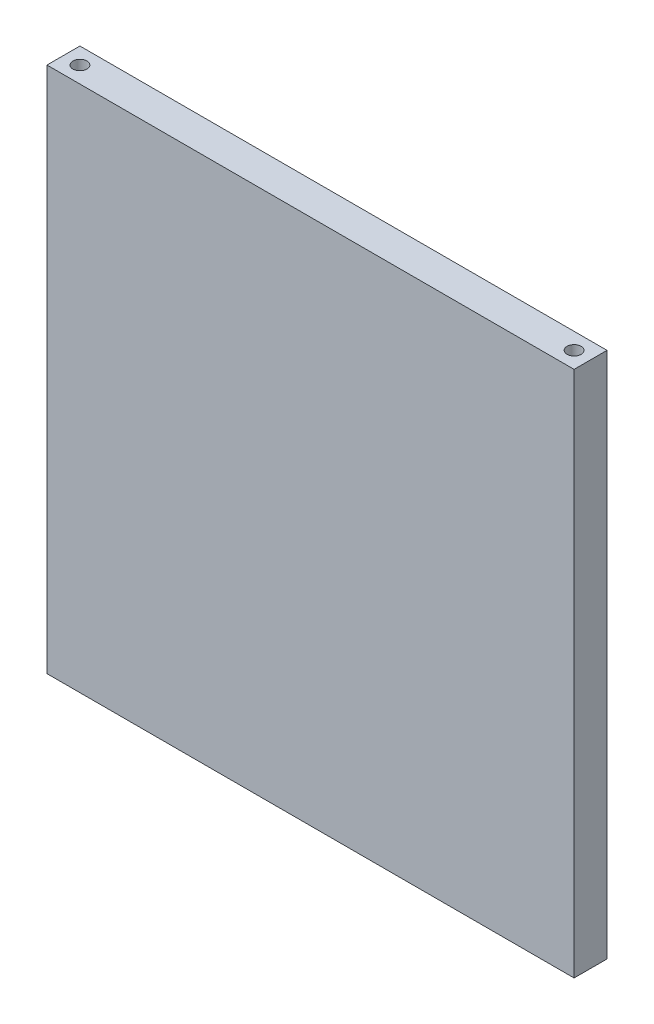
ISO-10303-21;
HEADER;
FILE_DESCRIPTION(('STEP AP214'),'2;1');
FILE_NAME('part.step','',(''),(''),'','','');
FILE_SCHEMA(('AUTOMOTIVE_DESIGN { 1 0 10303 214 1 1 1 1 }'));
ENDSEC;
DATA;
#1=APPLICATION_CONTEXT('core data for automotive mechanical design processes');
#2=APPLICATION_PROTOCOL_DEFINITION('international standard','automotive_design',2000,#1);
#3=PRODUCT_CONTEXT('',#1,'mechanical');
#4=PRODUCT('Part','Part','',(#3));
#5=PRODUCT_RELATED_PRODUCT_CATEGORY('part','',(#4));
#6=PRODUCT_DEFINITION_FORMATION('','',#4);
#7=PRODUCT_DEFINITION_CONTEXT('part definition',#1,'design');
#8=PRODUCT_DEFINITION('design','',#6,#7);
#9=PRODUCT_DEFINITION_SHAPE('','',#8);
#10=(LENGTH_UNIT() NAMED_UNIT(*) SI_UNIT(.MILLI.,.METRE.));
#11=(NAMED_UNIT(*) PLANE_ANGLE_UNIT() SI_UNIT($,.RADIAN.));
#12=(NAMED_UNIT(*) SI_UNIT($,.STERADIAN.) SOLID_ANGLE_UNIT());
#13=UNCERTAINTY_MEASURE_WITH_UNIT(LENGTH_MEASURE(1.E-05),#10,'distance_accuracy_value','');
#14=(GEOMETRIC_REPRESENTATION_CONTEXT(3) GLOBAL_UNCERTAINTY_ASSIGNED_CONTEXT((#13)) GLOBAL_UNIT_ASSIGNED_CONTEXT((#10,
#11,#12)) REPRESENTATION_CONTEXT('',''));
#15=CARTESIAN_POINT('',(0.,0.,0.));
#16=DIRECTION('',(0.,0.,1.));
#17=DIRECTION('',(1.,0.,0.));
#18=AXIS2_PLACEMENT_3D('',#15,#16,#17);
#19=CARTESIAN_POINT('',(0.,0.,6.35));
#20=DIRECTION('',(1.,0.,0.));
#21=DIRECTION('',(0.,1.,0.));
#22=AXIS2_PLACEMENT_3D('',#19,#20,#21);
#23=PLANE('',#22);
#24=DIRECTION('',(0.,-1.,0.));
#25=VECTOR('',#24,1.);
#26=CARTESIAN_POINT('',(0.,0.,0.));
#27=LINE('',#26,#25);
#28=CARTESIAN_POINT('',(0.,101.6,0.));
#29=VERTEX_POINT('',#28);
#30=CARTESIAN_POINT('',(0.,0.,0.));
#31=VERTEX_POINT('',#30);
#32=EDGE_CURVE('E130',#29,#31,#27,.T.);
#33=ORIENTED_EDGE('',*,*,#32,.T.);
#34=DIRECTION('',(0.,0.,-1.));
#35=VECTOR('',#34,1.);
#36=CARTESIAN_POINT('',(0.,0.,6.35));
#37=LINE('',#36,#35);
#38=CARTESIAN_POINT('',(0.,0.,6.35));
#39=VERTEX_POINT('',#38);
#40=EDGE_CURVE('E11',#39,#31,#37,.T.);
#41=ORIENTED_EDGE('',*,*,#40,.F.);
#42=DIRECTION('',(0.,-1.,0.));
#43=VECTOR('',#42,1.);
#44=CARTESIAN_POINT('',(0.,0.,6.35));
#45=LINE('',#44,#43);
#46=CARTESIAN_POINT('',(0.,101.6,6.35));
#47=VERTEX_POINT('',#46);
#48=EDGE_CURVE('E131',#47,#39,#45,.T.);
#49=ORIENTED_EDGE('',*,*,#48,.F.);
#50=DIRECTION('',(0.,0.,-1.));
#51=VECTOR('',#50,1.);
#52=CARTESIAN_POINT('',(0.,101.6,6.35));
#53=LINE('',#52,#51);
#54=EDGE_CURVE('E137',#47,#29,#53,.T.);
#55=ORIENTED_EDGE('',*,*,#54,.T.);
#56=EDGE_LOOP('',(#33,#41,#49,#55));
#57=FACE_BOUND('',#56,.T.);
#58=ADVANCED_FACE('F37',(#57),#23,.F.);
#59=CARTESIAN_POINT('',(0.,0.,6.35));
#60=DIRECTION('',(0.,1.,0.));
#61=DIRECTION('',(0.,0.,1.));
#62=AXIS2_PLACEMENT_3D('',#59,#60,#61);
#63=PLANE('',#62);
#64=CARTESIAN_POINT('',(3.17500000000002,0.,3.175));
#65=DIRECTION('',(0.,-1.,0.));
#66=DIRECTION('',(0.,0.,-1.));
#67=AXIS2_PLACEMENT_3D('',#64,#65,#66);
#68=CIRCLE('',#67,1.35254999999999);
#69=CARTESIAN_POINT('',(3.17500000000002,0.,1.82245000000001));
#70=VERTEX_POINT('',#69);
#71=EDGE_CURVE('E108',#70,#70,#68,.T.);
#72=ORIENTED_EDGE('',*,*,#71,.F.);
#73=EDGE_LOOP('',(#72));
#74=FACE_BOUND('',#73,.T.);
#75=CARTESIAN_POINT('',(98.425,0.,3.175));
#76=DIRECTION('',(0.,-1.,0.));
#77=DIRECTION('',(0.,0.,-1.));
#78=AXIS2_PLACEMENT_3D('',#75,#76,#77);
#79=CIRCLE('',#78,1.35254999999999);
#80=CARTESIAN_POINT('',(98.425,0.,1.82245000000001));
#81=VERTEX_POINT('',#80);
#82=EDGE_CURVE('E107',#81,#81,#79,.T.);
#83=ORIENTED_EDGE('',*,*,#82,.F.);
#84=EDGE_LOOP('',(#83));
#85=FACE_BOUND('',#84,.T.);
#86=DIRECTION('',(1.,0.,0.));
#87=VECTOR('',#86,1.);
#88=CARTESIAN_POINT('',(0.,0.,0.));
#89=LINE('',#88,#87);
#90=CARTESIAN_POINT('',(101.6,0.,0.));
#91=VERTEX_POINT('',#90);
#92=EDGE_CURVE('E140',#31,#91,#89,.T.);
#93=ORIENTED_EDGE('',*,*,#92,.T.);
#94=DIRECTION('',(0.,0.,-1.));
#95=VECTOR('',#94,1.);
#96=CARTESIAN_POINT('',(101.6,0.,6.35));
#97=LINE('',#96,#95);
#98=CARTESIAN_POINT('',(101.6,0.,6.35));
#99=VERTEX_POINT('',#98);
#100=EDGE_CURVE('E45',#99,#91,#97,.T.);
#101=ORIENTED_EDGE('',*,*,#100,.F.);
#102=DIRECTION('',(1.,0.,0.));
#103=VECTOR('',#102,1.);
#104=CARTESIAN_POINT('',(0.,0.,6.35));
#105=LINE('',#104,#103);
#106=EDGE_CURVE('E84',#39,#99,#105,.T.);
#107=ORIENTED_EDGE('',*,*,#106,.F.);
#108=ORIENTED_EDGE('',*,*,#40,.T.);
#109=EDGE_LOOP('',(#93,#101,#107,#108));
#110=FACE_BOUND('',#109,.T.);
#111=ADVANCED_FACE('F164',(#74,#85,#110),#63,.F.);
#112=CARTESIAN_POINT('',(101.6,0.,6.35));
#113=DIRECTION('',(-1.,0.,0.));
#114=DIRECTION('',(0.,-1.,0.));
#115=AXIS2_PLACEMENT_3D('',#112,#113,#114);
#116=PLANE('',#115);
#117=DIRECTION('',(0.,1.,0.));
#118=VECTOR('',#117,1.);
#119=CARTESIAN_POINT('',(101.6,0.,0.));
#120=LINE('',#119,#118);
#121=CARTESIAN_POINT('',(101.6,101.6,0.));
#122=VERTEX_POINT('',#121);
#123=EDGE_CURVE('E71',#91,#122,#120,.T.);
#124=ORIENTED_EDGE('',*,*,#123,.T.);
#125=DIRECTION('',(0.,0.,-1.));
#126=VECTOR('',#125,1.);
#127=CARTESIAN_POINT('',(101.6,101.6,6.35));
#128=LINE('',#127,#126);
#129=CARTESIAN_POINT('',(101.6,101.6,6.35));
#130=VERTEX_POINT('',#129);
#131=EDGE_CURVE('E145',#130,#122,#128,.T.);
#132=ORIENTED_EDGE('',*,*,#131,.F.);
#133=DIRECTION('',(0.,1.,0.));
#134=VECTOR('',#133,1.);
#135=CARTESIAN_POINT('',(101.6,0.,6.35));
#136=LINE('',#135,#134);
#137=EDGE_CURVE('E134',#99,#130,#136,.T.);
#138=ORIENTED_EDGE('',*,*,#137,.F.);
#139=ORIENTED_EDGE('',*,*,#100,.T.);
#140=EDGE_LOOP('',(#124,#132,#138,#139));
#141=FACE_BOUND('',#140,.T.);
#142=ADVANCED_FACE('F147',(#141),#116,.F.);
#143=CARTESIAN_POINT('',(0.,101.6,6.35));
#144=DIRECTION('',(0.,-1.,0.));
#145=DIRECTION('',(0.,0.,-1.));
#146=AXIS2_PLACEMENT_3D('',#143,#144,#145);
#147=PLANE('',#146);
#148=CARTESIAN_POINT('',(3.175,101.6,3.175));
#149=DIRECTION('',(0.,1.,0.));
#150=DIRECTION('',(0.,0.,1.));
#151=AXIS2_PLACEMENT_3D('',#148,#149,#150);
#152=CIRCLE('',#151,1.35254999999999);
#153=CARTESIAN_POINT('',(3.175,101.6,4.52754999999999));
#154=VERTEX_POINT('',#153);
#155=EDGE_CURVE('E118',#154,#154,#152,.T.);
#156=ORIENTED_EDGE('',*,*,#155,.F.);
#157=EDGE_LOOP('',(#156));
#158=FACE_BOUND('',#157,.T.);
#159=CARTESIAN_POINT('',(98.425,101.6,3.175));
#160=DIRECTION('',(0.,1.,0.));
#161=DIRECTION('',(0.,0.,1.));
#162=AXIS2_PLACEMENT_3D('',#159,#160,#161);
#163=CIRCLE('',#162,1.35254999999999);
#164=CARTESIAN_POINT('',(98.425,101.6,4.52754999999999));
#165=VERTEX_POINT('',#164);
#166=EDGE_CURVE('E124',#165,#165,#163,.T.);
#167=ORIENTED_EDGE('',*,*,#166,.F.);
#168=EDGE_LOOP('',(#167));
#169=FACE_BOUND('',#168,.T.);
#170=DIRECTION('',(-1.,0.,0.));
#171=VECTOR('',#170,1.);
#172=CARTESIAN_POINT('',(0.,101.6,0.));
#173=LINE('',#172,#171);
#174=EDGE_CURVE('E77',#122,#29,#173,.T.);
#175=ORIENTED_EDGE('',*,*,#174,.T.);
#176=ORIENTED_EDGE('',*,*,#54,.F.);
#177=DIRECTION('',(-1.,0.,0.));
#178=VECTOR('',#177,1.);
#179=CARTESIAN_POINT('',(0.,101.6,6.35));
#180=LINE('',#179,#178);
#181=EDGE_CURVE('E53',#130,#47,#180,.T.);
#182=ORIENTED_EDGE('',*,*,#181,.F.);
#183=ORIENTED_EDGE('',*,*,#131,.T.);
#184=EDGE_LOOP('',(#175,#176,#182,#183));
#185=FACE_BOUND('',#184,.T.);
#186=ADVANCED_FACE('F154',(#158,#169,#185),#147,.F.);
#187=CARTESIAN_POINT('',(0.,0.,6.35));
#188=DIRECTION('',(0.,0.,-1.));
#189=DIRECTION('',(-1.,0.,0.));
#190=AXIS2_PLACEMENT_3D('',#187,#188,#189);
#191=PLANE('',#190);
#192=ORIENTED_EDGE('',*,*,#48,.T.);
#193=ORIENTED_EDGE('',*,*,#106,.T.);
#194=ORIENTED_EDGE('',*,*,#137,.T.);
#195=ORIENTED_EDGE('',*,*,#181,.T.);
#196=EDGE_LOOP('',(#192,#193,#194,#195));
#197=FACE_BOUND('',#196,.T.);
#198=ADVANCED_FACE('F156',(#197),#191,.F.);
#199=CARTESIAN_POINT('',(0.,0.,0.));
#200=DIRECTION('',(0.,0.,-1.));
#201=DIRECTION('',(-1.,0.,0.));
#202=AXIS2_PLACEMENT_3D('',#199,#200,#201);
#203=PLANE('',#202);
#204=ORIENTED_EDGE('',*,*,#32,.F.);
#205=ORIENTED_EDGE('',*,*,#174,.F.);
#206=ORIENTED_EDGE('',*,*,#123,.F.);
#207=ORIENTED_EDGE('',*,*,#92,.F.);
#208=EDGE_LOOP('',(#204,#205,#206,#207));
#209=FACE_BOUND('',#208,.T.);
#210=ADVANCED_FACE('F150',(#209),#203,.T.);
#211=CARTESIAN_POINT('',(98.425,92.202,3.175));
#212=DIRECTION('',(0.,1.,0.));
#213=DIRECTION('',(0.,0.,1.));
#214=AXIS2_PLACEMENT_3D('',#211,#212,#213);
#215=CONICAL_SURFACE('',#214,1.35254999999999,1.02974425867665);
#216=CARTESIAN_POINT('',(98.425,91.3893059697343,3.175));
#217=VERTEX_POINT('',#216);
#218=VERTEX_LOOP('',#217);
#219=FACE_BOUND('',#218,.T.);
#220=CARTESIAN_POINT('',(98.425,92.202,3.175));
#221=DIRECTION('',(0.,1.,0.));
#222=DIRECTION('',(0.,0.,1.));
#223=AXIS2_PLACEMENT_3D('',#220,#221,#222);
#224=CIRCLE('',#223,1.35254999999999);
#225=CARTESIAN_POINT('',(98.425,92.202,4.52754999999999));
#226=VERTEX_POINT('',#225);
#227=EDGE_CURVE('E127',#226,#226,#224,.T.);
#228=ORIENTED_EDGE('',*,*,#227,.T.);
#229=EDGE_LOOP('',(#228));
#230=FACE_BOUND('',#229,.T.);
#231=ADVANCED_FACE('F203',(#219,#230),#215,.F.);
#232=CARTESIAN_POINT('',(98.425,101.6,3.175));
#233=DIRECTION('',(0.,1.,0.));
#234=DIRECTION('',(0.,0.,1.));
#235=AXIS2_PLACEMENT_3D('',#232,#233,#234);
#236=CYLINDRICAL_SURFACE('',#235,1.35254999999999);
#237=ORIENTED_EDGE('',*,*,#227,.F.);
#238=EDGE_LOOP('',(#237));
#239=FACE_BOUND('',#238,.T.);
#240=ORIENTED_EDGE('',*,*,#166,.T.);
#241=EDGE_LOOP('',(#240));
#242=FACE_BOUND('',#241,.T.);
#243=ADVANCED_FACE('F199',(#239,#242),#236,.F.);
#244=CARTESIAN_POINT('',(3.175,92.202,3.175));
#245=DIRECTION('',(0.,1.,0.));
#246=DIRECTION('',(0.,0.,1.));
#247=AXIS2_PLACEMENT_3D('',#244,#245,#246);
#248=CONICAL_SURFACE('',#247,1.35254999999999,1.02974425867665);
#249=CARTESIAN_POINT('',(3.175,91.3893059697343,3.175));
#250=VERTEX_POINT('',#249);
#251=VERTEX_LOOP('',#250);
#252=FACE_BOUND('',#251,.T.);
#253=CARTESIAN_POINT('',(3.175,92.202,3.175));
#254=DIRECTION('',(0.,1.,0.));
#255=DIRECTION('',(0.,0.,1.));
#256=AXIS2_PLACEMENT_3D('',#253,#254,#255);
#257=CIRCLE('',#256,1.35254999999999);
#258=CARTESIAN_POINT('',(3.175,92.202,4.52754999999999));
#259=VERTEX_POINT('',#258);
#260=EDGE_CURVE('E121',#259,#259,#257,.T.);
#261=ORIENTED_EDGE('',*,*,#260,.T.);
#262=EDGE_LOOP('',(#261));
#263=FACE_BOUND('',#262,.T.);
#264=ADVANCED_FACE('F195',(#252,#263),#248,.F.);
#265=CARTESIAN_POINT('',(3.175,101.6,3.175));
#266=DIRECTION('',(0.,1.,0.));
#267=DIRECTION('',(0.,0.,1.));
#268=AXIS2_PLACEMENT_3D('',#265,#266,#267);
#269=CYLINDRICAL_SURFACE('',#268,1.35254999999999);
#270=ORIENTED_EDGE('',*,*,#260,.F.);
#271=EDGE_LOOP('',(#270));
#272=FACE_BOUND('',#271,.T.);
#273=ORIENTED_EDGE('',*,*,#155,.T.);
#274=EDGE_LOOP('',(#273));
#275=FACE_BOUND('',#274,.T.);
#276=ADVANCED_FACE('F187',(#272,#275),#269,.F.);
#277=CARTESIAN_POINT('',(98.425,9.39800000000003,3.175));
#278=DIRECTION('',(0.,-1.,0.));
#279=DIRECTION('',(0.,0.,-1.));
#280=AXIS2_PLACEMENT_3D('',#277,#278,#279);
#281=CONICAL_SURFACE('',#280,1.35254999999999,1.02974425867665);
#282=CARTESIAN_POINT('',(98.425,10.2106940302658,3.175));
#283=VERTEX_POINT('',#282);
#284=VERTEX_LOOP('',#283);
#285=FACE_BOUND('',#284,.T.);
#286=CARTESIAN_POINT('',(98.425,9.39800000000003,3.175));
#287=DIRECTION('',(0.,-1.,0.));
#288=DIRECTION('',(0.,0.,-1.));
#289=AXIS2_PLACEMENT_3D('',#286,#287,#288);
#290=CIRCLE('',#289,1.35254999999999);
#291=CARTESIAN_POINT('',(98.425,9.39800000000003,1.82245000000001));
#292=VERTEX_POINT('',#291);
#293=EDGE_CURVE('E111',#292,#292,#290,.T.);
#294=ORIENTED_EDGE('',*,*,#293,.T.);
#295=EDGE_LOOP('',(#294));
#296=FACE_BOUND('',#295,.T.);
#297=ADVANCED_FACE('F181',(#285,#296),#281,.F.);
#298=CARTESIAN_POINT('',(98.425,0.,3.175));
#299=DIRECTION('',(0.,-1.,0.));
#300=DIRECTION('',(0.,0.,-1.));
#301=AXIS2_PLACEMENT_3D('',#298,#299,#300);
#302=CYLINDRICAL_SURFACE('',#301,1.35254999999999);
#303=ORIENTED_EDGE('',*,*,#293,.F.);
#304=EDGE_LOOP('',(#303));
#305=FACE_BOUND('',#304,.T.);
#306=ORIENTED_EDGE('',*,*,#82,.T.);
#307=EDGE_LOOP('',(#306));
#308=FACE_BOUND('',#307,.T.);
#309=ADVANCED_FACE('F101',(#305,#308),#302,.F.);
#310=CARTESIAN_POINT('',(3.17500000000002,9.39799999999999,3.175));
#311=DIRECTION('',(0.,-1.,0.));
#312=DIRECTION('',(0.,0.,-1.));
#313=AXIS2_PLACEMENT_3D('',#310,#311,#312);
#314=CONICAL_SURFACE('',#313,1.35254999999999,1.02974425867665);
#315=CARTESIAN_POINT('',(3.17500000000002,10.2106940302657,3.175));
#316=VERTEX_POINT('',#315);
#317=VERTEX_LOOP('',#316);
#318=FACE_BOUND('',#317,.T.);
#319=CARTESIAN_POINT('',(3.17500000000002,9.39799999999999,3.175));
#320=DIRECTION('',(0.,-1.,0.));
#321=DIRECTION('',(0.,0.,-1.));
#322=AXIS2_PLACEMENT_3D('',#319,#320,#321);
#323=CIRCLE('',#322,1.35254999999999);
#324=CARTESIAN_POINT('',(3.17500000000002,9.39799999999999,1.82245000000001));
#325=VERTEX_POINT('',#324);
#326=EDGE_CURVE('E105',#325,#325,#323,.T.);
#327=ORIENTED_EDGE('',*,*,#326,.T.);
#328=EDGE_LOOP('',(#327));
#329=FACE_BOUND('',#328,.T.);
#330=ADVANCED_FACE('F97',(#318,#329),#314,.F.);
#331=CARTESIAN_POINT('',(3.17500000000002,0.,3.175));
#332=DIRECTION('',(0.,-1.,0.));
#333=DIRECTION('',(0.,0.,-1.));
#334=AXIS2_PLACEMENT_3D('',#331,#332,#333);
#335=CYLINDRICAL_SURFACE('',#334,1.35254999999999);
#336=ORIENTED_EDGE('',*,*,#326,.F.);
#337=EDGE_LOOP('',(#336));
#338=FACE_BOUND('',#337,.T.);
#339=ORIENTED_EDGE('',*,*,#71,.T.);
#340=EDGE_LOOP('',(#339));
#341=FACE_BOUND('',#340,.T.);
#342=ADVANCED_FACE('F100',(#338,#341),#335,.F.);
#343=CLOSED_SHELL('',(#58,#111,#142,#186,#198,#210,#231,#243,#264,#276,#297,#309,#330,#342));
#344=MANIFOLD_SOLID_BREP('B2',#343);
#345=ADVANCED_BREP_SHAPE_REPRESENTATION('',(#18,#344),#14);
#346=SHAPE_DEFINITION_REPRESENTATION(#9,#345);
ENDSEC;
END-ISO-10303-21;
